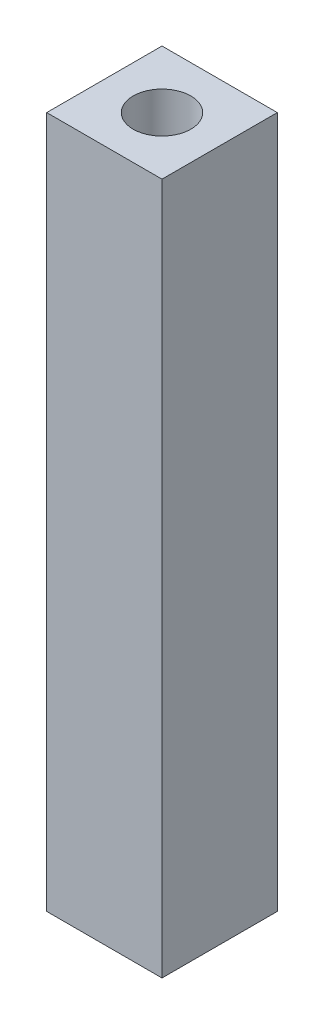
ISO-10303-21;
HEADER;
FILE_DESCRIPTION(('STEP AP214'),'2;1');
FILE_NAME('part.step','',(''),(''),'','','');
FILE_SCHEMA(('AUTOMOTIVE_DESIGN { 1 0 10303 214 1 1 1 1 }'));
ENDSEC;
DATA;
#1=APPLICATION_CONTEXT('core data for automotive mechanical design processes');
#2=APPLICATION_PROTOCOL_DEFINITION('international standard','automotive_design',2000,#1);
#3=PRODUCT_CONTEXT('',#1,'mechanical');
#4=PRODUCT('Part','Part','',(#3));
#5=PRODUCT_RELATED_PRODUCT_CATEGORY('part','',(#4));
#6=PRODUCT_DEFINITION_FORMATION('','',#4);
#7=PRODUCT_DEFINITION_CONTEXT('part definition',#1,'design');
#8=PRODUCT_DEFINITION('design','',#6,#7);
#9=PRODUCT_DEFINITION_SHAPE('','',#8);
#10=(LENGTH_UNIT() NAMED_UNIT(*) SI_UNIT(.MILLI.,.METRE.));
#11=(NAMED_UNIT(*) PLANE_ANGLE_UNIT() SI_UNIT($,.RADIAN.));
#12=(NAMED_UNIT(*) SI_UNIT($,.STERADIAN.) SOLID_ANGLE_UNIT());
#13=UNCERTAINTY_MEASURE_WITH_UNIT(LENGTH_MEASURE(1.E-05),#10,'distance_accuracy_value','');
#14=(GEOMETRIC_REPRESENTATION_CONTEXT(3) GLOBAL_UNCERTAINTY_ASSIGNED_CONTEXT((#13)) GLOBAL_UNIT_ASSIGNED_CONTEXT((#10,
#11,#12)) REPRESENTATION_CONTEXT('',''));
#15=CARTESIAN_POINT('',(0.,0.,0.));
#16=DIRECTION('',(0.,0.,1.));
#17=DIRECTION('',(1.,0.,0.));
#18=AXIS2_PLACEMENT_3D('',#15,#16,#17);
#19=CARTESIAN_POINT('',(5.,60.,-5.));
#20=DIRECTION('',(-1.,0.,0.));
#21=DIRECTION('',(0.,0.,1.));
#22=AXIS2_PLACEMENT_3D('',#19,#20,#21);
#23=PLANE('',#22);
#24=DIRECTION('',(0.,0.,-1.));
#25=VECTOR('',#24,1.);
#26=CARTESIAN_POINT('',(5.,0.,-5.));
#27=LINE('',#26,#25);
#28=CARTESIAN_POINT('',(5.,0.,5.));
#29=VERTEX_POINT('',#28);
#30=CARTESIAN_POINT('',(5.,0.,-5.));
#31=VERTEX_POINT('',#30);
#32=EDGE_CURVE('E99',#29,#31,#27,.T.);
#33=ORIENTED_EDGE('',*,*,#32,.T.);
#34=DIRECTION('',(0.,-1.,0.));
#35=VECTOR('',#34,1.);
#36=CARTESIAN_POINT('',(5.,60.,-5.));
#37=LINE('',#36,#35);
#38=CARTESIAN_POINT('',(5.,60.,-5.));
#39=VERTEX_POINT('',#38);
#40=EDGE_CURVE('E11',#39,#31,#37,.T.);
#41=ORIENTED_EDGE('',*,*,#40,.F.);
#42=DIRECTION('',(0.,0.,-1.));
#43=VECTOR('',#42,1.);
#44=CARTESIAN_POINT('',(5.,60.,-5.));
#45=LINE('',#44,#43);
#46=CARTESIAN_POINT('',(5.,60.,5.));
#47=VERTEX_POINT('',#46);
#48=EDGE_CURVE('E87',#47,#39,#45,.T.);
#49=ORIENTED_EDGE('',*,*,#48,.F.);
#50=DIRECTION('',(0.,-1.,0.));
#51=VECTOR('',#50,1.);
#52=CARTESIAN_POINT('',(5.,60.,5.));
#53=LINE('',#52,#51);
#54=EDGE_CURVE('E95',#47,#29,#53,.T.);
#55=ORIENTED_EDGE('',*,*,#54,.T.);
#56=EDGE_LOOP('',(#33,#41,#49,#55));
#57=FACE_BOUND('',#56,.T.);
#58=ADVANCED_FACE('F36',(#57),#23,.F.);
#59=CARTESIAN_POINT('',(-5.,60.,-5.));
#60=DIRECTION('',(0.,0.,1.));
#61=DIRECTION('',(1.,0.,0.));
#62=AXIS2_PLACEMENT_3D('',#59,#60,#61);
#63=PLANE('',#62);
#64=DIRECTION('',(-1.,0.,0.));
#65=VECTOR('',#64,1.);
#66=CARTESIAN_POINT('',(-5.,0.,-5.));
#67=LINE('',#66,#65);
#68=CARTESIAN_POINT('',(-5.,0.,-5.));
#69=VERTEX_POINT('',#68);
#70=EDGE_CURVE('E91',#31,#69,#67,.T.);
#71=ORIENTED_EDGE('',*,*,#70,.T.);
#72=DIRECTION('',(0.,-1.,0.));
#73=VECTOR('',#72,1.);
#74=CARTESIAN_POINT('',(-5.,60.,-5.));
#75=LINE('',#74,#73);
#76=CARTESIAN_POINT('',(-5.,60.,-5.));
#77=VERTEX_POINT('',#76);
#78=EDGE_CURVE('E44',#77,#69,#75,.T.);
#79=ORIENTED_EDGE('',*,*,#78,.F.);
#80=DIRECTION('',(-1.,0.,0.));
#81=VECTOR('',#80,1.);
#82=CARTESIAN_POINT('',(-5.,60.,-5.));
#83=LINE('',#82,#81);
#84=EDGE_CURVE('E82',#39,#77,#83,.T.);
#85=ORIENTED_EDGE('',*,*,#84,.F.);
#86=ORIENTED_EDGE('',*,*,#40,.T.);
#87=EDGE_LOOP('',(#71,#79,#85,#86));
#88=FACE_BOUND('',#87,.T.);
#89=ADVANCED_FACE('F90',(#88),#63,.F.);
#90=CARTESIAN_POINT('',(-5.,60.,-5.));
#91=DIRECTION('',(1.,0.,0.));
#92=DIRECTION('',(0.,0.,-1.));
#93=AXIS2_PLACEMENT_3D('',#90,#91,#92);
#94=PLANE('',#93);
#95=DIRECTION('',(0.,0.,1.));
#96=VECTOR('',#95,1.);
#97=CARTESIAN_POINT('',(-5.,0.,-5.));
#98=LINE('',#97,#96);
#99=CARTESIAN_POINT('',(-5.,0.,5.));
#100=VERTEX_POINT('',#99);
#101=EDGE_CURVE('E69',#69,#100,#98,.T.);
#102=ORIENTED_EDGE('',*,*,#101,.T.);
#103=DIRECTION('',(0.,-1.,0.));
#104=VECTOR('',#103,1.);
#105=CARTESIAN_POINT('',(-5.,60.,5.));
#106=LINE('',#105,#104);
#107=CARTESIAN_POINT('',(-5.,60.,5.));
#108=VERTEX_POINT('',#107);
#109=EDGE_CURVE('E92',#108,#100,#106,.T.);
#110=ORIENTED_EDGE('',*,*,#109,.F.);
#111=DIRECTION('',(0.,0.,1.));
#112=VECTOR('',#111,1.);
#113=CARTESIAN_POINT('',(-5.,60.,-5.));
#114=LINE('',#113,#112);
#115=EDGE_CURVE('E85',#77,#108,#114,.T.);
#116=ORIENTED_EDGE('',*,*,#115,.F.);
#117=ORIENTED_EDGE('',*,*,#78,.T.);
#118=EDGE_LOOP('',(#102,#110,#116,#117));
#119=FACE_BOUND('',#118,.T.);
#120=ADVANCED_FACE('F93',(#119),#94,.F.);
#121=CARTESIAN_POINT('',(-5.,60.,5.));
#122=DIRECTION('',(0.,0.,-1.));
#123=DIRECTION('',(-1.,0.,0.));
#124=AXIS2_PLACEMENT_3D('',#121,#122,#123);
#125=PLANE('',#124);
#126=DIRECTION('',(1.,0.,0.));
#127=VECTOR('',#126,1.);
#128=CARTESIAN_POINT('',(-5.,0.,5.));
#129=LINE('',#128,#127);
#130=EDGE_CURVE('E75',#100,#29,#129,.T.);
#131=ORIENTED_EDGE('',*,*,#130,.T.);
#132=ORIENTED_EDGE('',*,*,#54,.F.);
#133=DIRECTION('',(1.,0.,0.));
#134=VECTOR('',#133,1.);
#135=CARTESIAN_POINT('',(-5.,60.,5.));
#136=LINE('',#135,#134);
#137=EDGE_CURVE('E52',#108,#47,#136,.T.);
#138=ORIENTED_EDGE('',*,*,#137,.F.);
#139=ORIENTED_EDGE('',*,*,#109,.T.);
#140=EDGE_LOOP('',(#131,#132,#138,#139));
#141=FACE_BOUND('',#140,.T.);
#142=ADVANCED_FACE('F107',(#141),#125,.F.);
#143=CARTESIAN_POINT('',(0.,60.,0.));
#144=DIRECTION('',(0.,1.,0.));
#145=DIRECTION('',(0.,0.,1.));
#146=AXIS2_PLACEMENT_3D('',#143,#144,#145);
#147=PLANE('',#146);
#148=CARTESIAN_POINT('',(0.,60.,0.));
#149=DIRECTION('',(0.,1.,0.));
#150=DIRECTION('',(0.,0.,1.));
#151=AXIS2_PLACEMENT_3D('',#148,#149,#150);
#152=CIRCLE('',#151,2.5);
#153=CARTESIAN_POINT('',(0.,60.,2.5));
#154=VERTEX_POINT('',#153);
#155=EDGE_CURVE('E113',#154,#154,#152,.T.);
#156=ORIENTED_EDGE('',*,*,#155,.F.);
#157=EDGE_LOOP('',(#156));
#158=FACE_BOUND('',#157,.T.);
#159=ORIENTED_EDGE('',*,*,#48,.T.);
#160=ORIENTED_EDGE('',*,*,#84,.T.);
#161=ORIENTED_EDGE('',*,*,#115,.T.);
#162=ORIENTED_EDGE('',*,*,#137,.T.);
#163=EDGE_LOOP('',(#159,#160,#161,#162));
#164=FACE_BOUND('',#163,.T.);
#165=ADVANCED_FACE('F83',(#158,#164),#147,.T.);
#166=CARTESIAN_POINT('',(0.,0.,0.));
#167=DIRECTION('',(0.,1.,0.));
#168=DIRECTION('',(0.,0.,1.));
#169=AXIS2_PLACEMENT_3D('',#166,#167,#168);
#170=PLANE('',#169);
#171=CARTESIAN_POINT('',(0.,0.,0.));
#172=DIRECTION('',(0.,1.,0.));
#173=DIRECTION('',(0.,0.,1.));
#174=AXIS2_PLACEMENT_3D('',#171,#172,#173);
#175=CIRCLE('',#174,2.5);
#176=CARTESIAN_POINT('',(0.,0.,2.5));
#177=VERTEX_POINT('',#176);
#178=EDGE_CURVE('E102',#177,#177,#175,.T.);
#179=ORIENTED_EDGE('',*,*,#178,.T.);
#180=EDGE_LOOP('',(#179));
#181=FACE_BOUND('',#180,.T.);
#182=ORIENTED_EDGE('',*,*,#32,.F.);
#183=ORIENTED_EDGE('',*,*,#130,.F.);
#184=ORIENTED_EDGE('',*,*,#101,.F.);
#185=ORIENTED_EDGE('',*,*,#70,.F.);
#186=EDGE_LOOP('',(#182,#183,#184,#185));
#187=FACE_BOUND('',#186,.T.);
#188=ADVANCED_FACE('F110',(#181,#187),#170,.F.);
#189=CARTESIAN_POINT('',(0.,0.,0.));
#190=DIRECTION('',(0.,1.,0.));
#191=DIRECTION('',(0.,0.,1.));
#192=AXIS2_PLACEMENT_3D('',#189,#190,#191);
#193=CYLINDRICAL_SURFACE('',#192,2.5);
#194=ORIENTED_EDGE('',*,*,#178,.F.);
#195=EDGE_LOOP('',(#194));
#196=FACE_BOUND('',#195,.T.);
#197=ORIENTED_EDGE('',*,*,#155,.T.);
#198=EDGE_LOOP('',(#197));
#199=FACE_BOUND('',#198,.T.);
#200=ADVANCED_FACE('F120',(#196,#199),#193,.F.);
#201=CLOSED_SHELL('',(#58,#89,#120,#142,#165,#188,#200));
#202=MANIFOLD_SOLID_BREP('B2',#201);
#203=ADVANCED_BREP_SHAPE_REPRESENTATION('',(#18,#202),#14);
#204=SHAPE_DEFINITION_REPRESENTATION(#9,#203);
ENDSEC;
END-ISO-10303-21;
